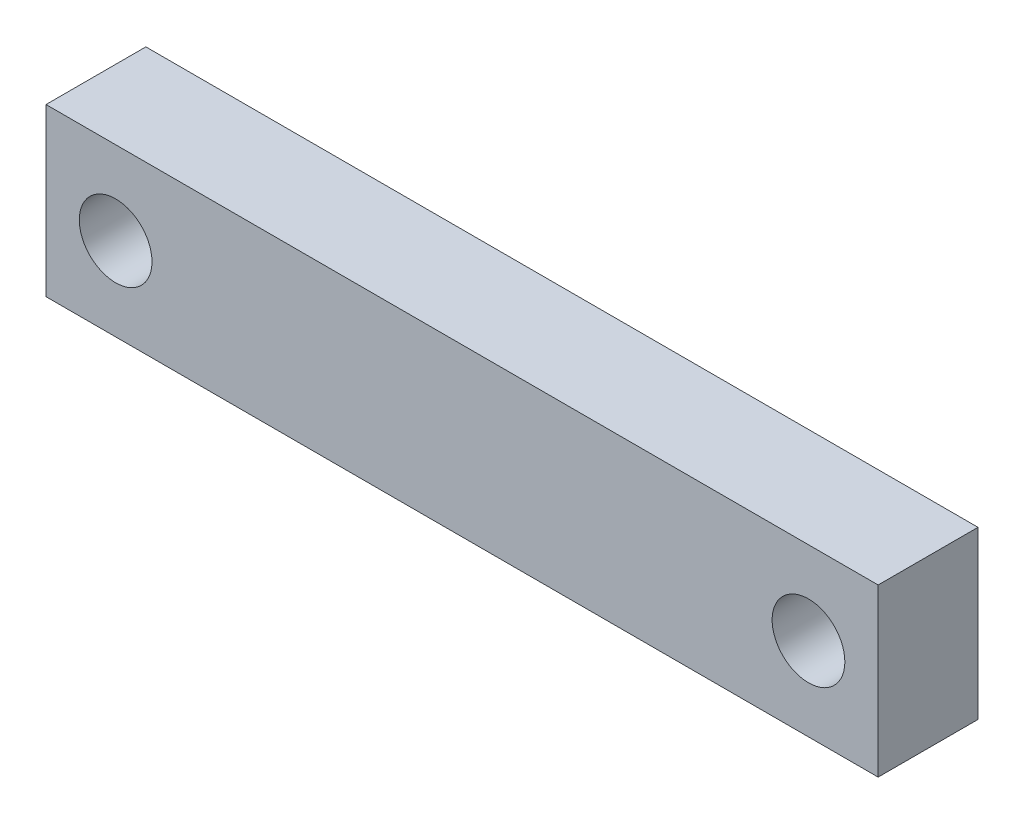
ISO-10303-21;
HEADER;
FILE_DESCRIPTION(('STEP AP214'),'2;1');
FILE_NAME('part.step','',(''),(''),'','','');
FILE_SCHEMA(('AUTOMOTIVE_DESIGN { 1 0 10303 214 1 1 1 1 }'));
ENDSEC;
DATA;
#1=APPLICATION_CONTEXT('core data for automotive mechanical design processes');
#2=APPLICATION_PROTOCOL_DEFINITION('international standard','automotive_design',2000,#1);
#3=PRODUCT_CONTEXT('',#1,'mechanical');
#4=PRODUCT('Part','Part','',(#3));
#5=PRODUCT_RELATED_PRODUCT_CATEGORY('part','',(#4));
#6=PRODUCT_DEFINITION_FORMATION('','',#4);
#7=PRODUCT_DEFINITION_CONTEXT('part definition',#1,'design');
#8=PRODUCT_DEFINITION('design','',#6,#7);
#9=PRODUCT_DEFINITION_SHAPE('','',#8);
#10=(LENGTH_UNIT() NAMED_UNIT(*) SI_UNIT(.MILLI.,.METRE.));
#11=(NAMED_UNIT(*) PLANE_ANGLE_UNIT() SI_UNIT($,.RADIAN.));
#12=(NAMED_UNIT(*) SI_UNIT($,.STERADIAN.) SOLID_ANGLE_UNIT());
#13=UNCERTAINTY_MEASURE_WITH_UNIT(LENGTH_MEASURE(1.E-05),#10,'distance_accuracy_value','');
#14=(GEOMETRIC_REPRESENTATION_CONTEXT(3) GLOBAL_UNCERTAINTY_ASSIGNED_CONTEXT((#13)) GLOBAL_UNIT_ASSIGNED_CONTEXT((#10,
#11,#12)) REPRESENTATION_CONTEXT('',''));
#15=CARTESIAN_POINT('',(0.,0.,0.));
#16=DIRECTION('',(0.,0.,1.));
#17=DIRECTION('',(1.,0.,0.));
#18=AXIS2_PLACEMENT_3D('',#15,#16,#17);
#19=CARTESIAN_POINT('',(12.5,-2.5,3.));
#20=DIRECTION('',(-1.,0.,0.));
#21=DIRECTION('',(0.,0.,1.));
#22=AXIS2_PLACEMENT_3D('',#19,#20,#21);
#23=PLANE('',#22);
#24=DIRECTION('',(0.,1.,0.));
#25=VECTOR('',#24,1.);
#26=CARTESIAN_POINT('',(12.5,-2.5,0.));
#27=LINE('',#26,#25);
#28=CARTESIAN_POINT('',(12.5,-2.5,0.));
#29=VERTEX_POINT('',#28);
#30=CARTESIAN_POINT('',(12.5,2.5,0.));
#31=VERTEX_POINT('',#30);
#32=EDGE_CURVE('E102',#29,#31,#27,.T.);
#33=ORIENTED_EDGE('',*,*,#32,.T.);
#34=DIRECTION('',(0.,0.,-1.));
#35=VECTOR('',#34,1.);
#36=CARTESIAN_POINT('',(12.5,2.5,3.));
#37=LINE('',#36,#35);
#38=CARTESIAN_POINT('',(12.5,2.5,3.));
#39=VERTEX_POINT('',#38);
#40=EDGE_CURVE('E11',#39,#31,#37,.T.);
#41=ORIENTED_EDGE('',*,*,#40,.F.);
#42=DIRECTION('',(0.,1.,0.));
#43=VECTOR('',#42,1.);
#44=CARTESIAN_POINT('',(12.5,-2.5,3.));
#45=LINE('',#44,#43);
#46=CARTESIAN_POINT('',(12.5,-2.5,3.));
#47=VERTEX_POINT('',#46);
#48=EDGE_CURVE('E90',#47,#39,#45,.T.);
#49=ORIENTED_EDGE('',*,*,#48,.F.);
#50=DIRECTION('',(0.,0.,-1.));
#51=VECTOR('',#50,1.);
#52=CARTESIAN_POINT('',(12.5,-2.5,3.));
#53=LINE('',#52,#51);
#54=EDGE_CURVE('E98',#47,#29,#53,.T.);
#55=ORIENTED_EDGE('',*,*,#54,.T.);
#56=EDGE_LOOP('',(#33,#41,#49,#55));
#57=FACE_BOUND('',#56,.T.);
#58=ADVANCED_FACE('F39',(#57),#23,.F.);
#59=CARTESIAN_POINT('',(-12.5,2.5,3.));
#60=DIRECTION('',(0.,-1.,0.));
#61=DIRECTION('',(0.,0.,-1.));
#62=AXIS2_PLACEMENT_3D('',#59,#60,#61);
#63=PLANE('',#62);
#64=DIRECTION('',(-1.,0.,0.));
#65=VECTOR('',#64,1.);
#66=CARTESIAN_POINT('',(-12.5,2.5,0.));
#67=LINE('',#66,#65);
#68=CARTESIAN_POINT('',(-12.5,2.5,0.));
#69=VERTEX_POINT('',#68);
#70=EDGE_CURVE('E94',#31,#69,#67,.T.);
#71=ORIENTED_EDGE('',*,*,#70,.T.);
#72=DIRECTION('',(0.,0.,-1.));
#73=VECTOR('',#72,1.);
#74=CARTESIAN_POINT('',(-12.5,2.5,3.));
#75=LINE('',#74,#73);
#76=CARTESIAN_POINT('',(-12.5,2.5,3.));
#77=VERTEX_POINT('',#76);
#78=EDGE_CURVE('E47',#77,#69,#75,.T.);
#79=ORIENTED_EDGE('',*,*,#78,.F.);
#80=DIRECTION('',(-1.,0.,0.));
#81=VECTOR('',#80,1.);
#82=CARTESIAN_POINT('',(-12.5,2.5,3.));
#83=LINE('',#82,#81);
#84=EDGE_CURVE('E85',#39,#77,#83,.T.);
#85=ORIENTED_EDGE('',*,*,#84,.F.);
#86=ORIENTED_EDGE('',*,*,#40,.T.);
#87=EDGE_LOOP('',(#71,#79,#85,#86));
#88=FACE_BOUND('',#87,.T.);
#89=ADVANCED_FACE('F93',(#88),#63,.F.);
#90=CARTESIAN_POINT('',(-12.5,-2.5,3.));
#91=DIRECTION('',(1.,0.,0.));
#92=DIRECTION('',(0.,0.,-1.));
#93=AXIS2_PLACEMENT_3D('',#90,#91,#92);
#94=PLANE('',#93);
#95=DIRECTION('',(0.,-1.,0.));
#96=VECTOR('',#95,1.);
#97=CARTESIAN_POINT('',(-12.5,-2.5,0.));
#98=LINE('',#97,#96);
#99=CARTESIAN_POINT('',(-12.5,-2.5,0.));
#100=VERTEX_POINT('',#99);
#101=EDGE_CURVE('E72',#69,#100,#98,.T.);
#102=ORIENTED_EDGE('',*,*,#101,.T.);
#103=DIRECTION('',(0.,0.,-1.));
#104=VECTOR('',#103,1.);
#105=CARTESIAN_POINT('',(-12.5,-2.5,3.));
#106=LINE('',#105,#104);
#107=CARTESIAN_POINT('',(-12.5,-2.5,3.));
#108=VERTEX_POINT('',#107);
#109=EDGE_CURVE('E95',#108,#100,#106,.T.);
#110=ORIENTED_EDGE('',*,*,#109,.F.);
#111=DIRECTION('',(0.,-1.,0.));
#112=VECTOR('',#111,1.);
#113=CARTESIAN_POINT('',(-12.5,-2.5,3.));
#114=LINE('',#113,#112);
#115=EDGE_CURVE('E88',#77,#108,#114,.T.);
#116=ORIENTED_EDGE('',*,*,#115,.F.);
#117=ORIENTED_EDGE('',*,*,#78,.T.);
#118=EDGE_LOOP('',(#102,#110,#116,#117));
#119=FACE_BOUND('',#118,.T.);
#120=ADVANCED_FACE('F96',(#119),#94,.F.);
#121=CARTESIAN_POINT('',(-12.5,-2.5,3.));
#122=DIRECTION('',(0.,1.,0.));
#123=DIRECTION('',(0.,0.,1.));
#124=AXIS2_PLACEMENT_3D('',#121,#122,#123);
#125=PLANE('',#124);
#126=DIRECTION('',(1.,0.,0.));
#127=VECTOR('',#126,1.);
#128=CARTESIAN_POINT('',(-12.5,-2.5,0.));
#129=LINE('',#128,#127);
#130=EDGE_CURVE('E78',#100,#29,#129,.T.);
#131=ORIENTED_EDGE('',*,*,#130,.T.);
#132=ORIENTED_EDGE('',*,*,#54,.F.);
#133=DIRECTION('',(1.,0.,0.));
#134=VECTOR('',#133,1.);
#135=CARTESIAN_POINT('',(-12.5,-2.5,3.));
#136=LINE('',#135,#134);
#137=EDGE_CURVE('E55',#108,#47,#136,.T.);
#138=ORIENTED_EDGE('',*,*,#137,.F.);
#139=ORIENTED_EDGE('',*,*,#109,.T.);
#140=EDGE_LOOP('',(#131,#132,#138,#139));
#141=FACE_BOUND('',#140,.T.);
#142=ADVANCED_FACE('F110',(#141),#125,.F.);
#143=CARTESIAN_POINT('',(0.,0.,3.));
#144=DIRECTION('',(0.,0.,-1.));
#145=DIRECTION('',(-1.,0.,0.));
#146=AXIS2_PLACEMENT_3D('',#143,#144,#145);
#147=PLANE('',#146);
#148=CARTESIAN_POINT('',(-10.4078,0.,3.));
#149=DIRECTION('',(0.,0.,1.));
#150=DIRECTION('',(1.,0.,0.));
#151=AXIS2_PLACEMENT_3D('',#148,#149,#150);
#152=CIRCLE('',#151,1.0922);
#153=CARTESIAN_POINT('',(-9.3156,0.,3.));
#154=VERTEX_POINT('',#153);
#155=EDGE_CURVE('E124',#154,#154,#152,.T.);
#156=ORIENTED_EDGE('',*,*,#155,.F.);
#157=EDGE_LOOP('',(#156));
#158=FACE_BOUND('',#157,.T.);
#159=CARTESIAN_POINT('',(10.4078,0.,3.));
#160=DIRECTION('',(0.,0.,1.));
#161=DIRECTION('',(1.,0.,0.));
#162=AXIS2_PLACEMENT_3D('',#159,#160,#161);
#163=CIRCLE('',#162,1.0922);
#164=CARTESIAN_POINT('',(11.5,0.,3.));
#165=VERTEX_POINT('',#164);
#166=EDGE_CURVE('E118',#165,#165,#163,.T.);
#167=ORIENTED_EDGE('',*,*,#166,.F.);
#168=EDGE_LOOP('',(#167));
#169=FACE_BOUND('',#168,.T.);
#170=ORIENTED_EDGE('',*,*,#48,.T.);
#171=ORIENTED_EDGE('',*,*,#84,.T.);
#172=ORIENTED_EDGE('',*,*,#115,.T.);
#173=ORIENTED_EDGE('',*,*,#137,.T.);
#174=EDGE_LOOP('',(#170,#171,#172,#173));
#175=FACE_BOUND('',#174,.T.);
#176=ADVANCED_FACE('F86',(#158,#169,#175),#147,.F.);
#177=CARTESIAN_POINT('',(0.,0.,0.));
#178=DIRECTION('',(0.,0.,-1.));
#179=DIRECTION('',(-1.,0.,0.));
#180=AXIS2_PLACEMENT_3D('',#177,#178,#179);
#181=PLANE('',#180);
#182=CARTESIAN_POINT('',(-10.4078,0.,0.));
#183=DIRECTION('',(0.,0.,1.));
#184=DIRECTION('',(1.,0.,0.));
#185=AXIS2_PLACEMENT_3D('',#182,#183,#184);
#186=CIRCLE('',#185,1.0922);
#187=CARTESIAN_POINT('',(-9.3156,0.,0.));
#188=VERTEX_POINT('',#187);
#189=EDGE_CURVE('E121',#188,#188,#186,.T.);
#190=ORIENTED_EDGE('',*,*,#189,.T.);
#191=EDGE_LOOP('',(#190));
#192=FACE_BOUND('',#191,.T.);
#193=CARTESIAN_POINT('',(10.4078,0.,0.));
#194=DIRECTION('',(0.,0.,1.));
#195=DIRECTION('',(1.,0.,0.));
#196=AXIS2_PLACEMENT_3D('',#193,#194,#195);
#197=CIRCLE('',#196,1.0922);
#198=CARTESIAN_POINT('',(11.5,0.,0.));
#199=VERTEX_POINT('',#198);
#200=EDGE_CURVE('E105',#199,#199,#197,.T.);
#201=ORIENTED_EDGE('',*,*,#200,.T.);
#202=EDGE_LOOP('',(#201));
#203=FACE_BOUND('',#202,.T.);
#204=ORIENTED_EDGE('',*,*,#32,.F.);
#205=ORIENTED_EDGE('',*,*,#130,.F.);
#206=ORIENTED_EDGE('',*,*,#101,.F.);
#207=ORIENTED_EDGE('',*,*,#70,.F.);
#208=EDGE_LOOP('',(#204,#205,#206,#207));
#209=FACE_BOUND('',#208,.T.);
#210=ADVANCED_FACE('F113',(#192,#203,#209),#181,.T.);
#211=CARTESIAN_POINT('',(10.4078,0.,3.));
#212=DIRECTION('',(0.,0.,1.));
#213=DIRECTION('',(1.,0.,0.));
#214=AXIS2_PLACEMENT_3D('',#211,#212,#213);
#215=CYLINDRICAL_SURFACE('',#214,1.0922);
#216=ORIENTED_EDGE('',*,*,#200,.F.);
#217=EDGE_LOOP('',(#216));
#218=FACE_BOUND('',#217,.T.);
#219=ORIENTED_EDGE('',*,*,#166,.T.);
#220=EDGE_LOOP('',(#219));
#221=FACE_BOUND('',#220,.T.);
#222=ADVANCED_FACE('F135',(#218,#221),#215,.F.);
#223=CARTESIAN_POINT('',(-10.4078,0.,3.));
#224=DIRECTION('',(0.,0.,1.));
#225=DIRECTION('',(1.,0.,0.));
#226=AXIS2_PLACEMENT_3D('',#223,#224,#225);
#227=CYLINDRICAL_SURFACE('',#226,1.0922);
#228=ORIENTED_EDGE('',*,*,#189,.F.);
#229=EDGE_LOOP('',(#228));
#230=FACE_BOUND('',#229,.T.);
#231=ORIENTED_EDGE('',*,*,#155,.T.);
#232=EDGE_LOOP('',(#231));
#233=FACE_BOUND('',#232,.T.);
#234=ADVANCED_FACE('F128',(#230,#233),#227,.F.);
#235=CLOSED_SHELL('',(#58,#89,#120,#142,#176,#210,#222,#234));
#236=MANIFOLD_SOLID_BREP('B2',#235);
#237=ADVANCED_BREP_SHAPE_REPRESENTATION('',(#18,#236),#14);
#238=SHAPE_DEFINITION_REPRESENTATION(#9,#237);
ENDSEC;
END-ISO-10303-21;
